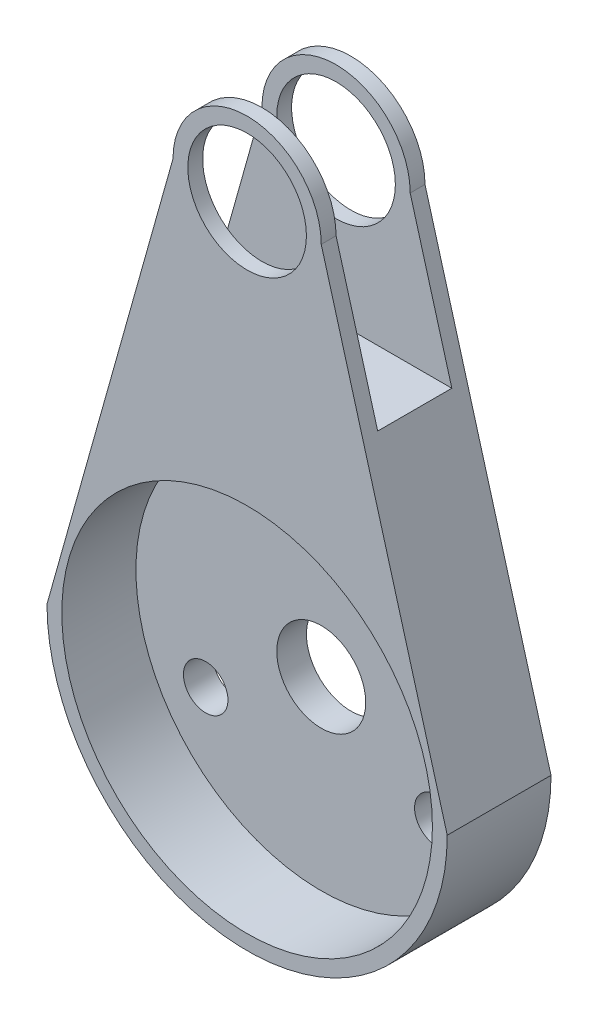
ISO-10303-21;
HEADER;
FILE_DESCRIPTION(('STEP AP214'),'2;1');
FILE_NAME('part.step','',(''),(''),'','','');
FILE_SCHEMA(('AUTOMOTIVE_DESIGN { 1 0 10303 214 1 1 1 1 }'));
ENDSEC;
DATA;
#1=APPLICATION_CONTEXT('core data for automotive mechanical design processes');
#2=APPLICATION_PROTOCOL_DEFINITION('international standard','automotive_design',2000,#1);
#3=PRODUCT_CONTEXT('',#1,'mechanical');
#4=PRODUCT('Part','Part','',(#3));
#5=PRODUCT_RELATED_PRODUCT_CATEGORY('part','',(#4));
#6=PRODUCT_DEFINITION_FORMATION('','',#4);
#7=PRODUCT_DEFINITION_CONTEXT('part definition',#1,'design');
#8=PRODUCT_DEFINITION('design','',#6,#7);
#9=PRODUCT_DEFINITION_SHAPE('','',#8);
#10=(LENGTH_UNIT() NAMED_UNIT(*) SI_UNIT(.MILLI.,.METRE.));
#11=(NAMED_UNIT(*) PLANE_ANGLE_UNIT() SI_UNIT($,.RADIAN.));
#12=(NAMED_UNIT(*) SI_UNIT($,.STERADIAN.) SOLID_ANGLE_UNIT());
#13=UNCERTAINTY_MEASURE_WITH_UNIT(LENGTH_MEASURE(1.E-05),#10,'distance_accuracy_value','');
#14=(GEOMETRIC_REPRESENTATION_CONTEXT(3) GLOBAL_UNCERTAINTY_ASSIGNED_CONTEXT((#13)) GLOBAL_UNIT_ASSIGNED_CONTEXT((#10,
#11,#12)) REPRESENTATION_CONTEXT('',''));
#15=CARTESIAN_POINT('',(0.,0.,0.));
#16=DIRECTION('',(0.,0.,1.));
#17=DIRECTION('',(1.,0.,0.));
#18=AXIS2_PLACEMENT_3D('',#15,#16,#17);
#19=CARTESIAN_POINT('',(0.,0.,7.));
#20=DIRECTION('',(0.,0.,-1.));
#21=DIRECTION('',(-1.,0.,0.));
#22=AXIS2_PLACEMENT_3D('',#19,#20,#21);
#23=CYLINDRICAL_SURFACE('',#22,5.);
#24=DIRECTION('',(0.,0.,-1.));
#25=VECTOR('',#24,1.);
#26=CARTESIAN_POINT('',(-5.,0.,7.));
#27=LINE('',#26,#25);
#28=CARTESIAN_POINT('',(-5.,0.,1.));
#29=VERTEX_POINT('',#28);
#30=CARTESIAN_POINT('',(-5.,0.,0.));
#31=VERTEX_POINT('',#30);
#32=EDGE_CURVE('E203',#29,#31,#27,.T.);
#33=ORIENTED_EDGE('',*,*,#32,.F.);
#34=CARTESIAN_POINT('',(0.,0.,0.999999999999998));
#35=DIRECTION('',(0.,0.,-1.));
#36=DIRECTION('',(-1.,0.,0.));
#37=AXIS2_PLACEMENT_3D('',#34,#35,#36);
#38=CIRCLE('',#37,5.);
#39=CARTESIAN_POINT('',(5.,0.,0.999999999999996));
#40=VERTEX_POINT('',#39);
#41=EDGE_CURVE('E144',#29,#40,#38,.T.);
#42=ORIENTED_EDGE('',*,*,#41,.T.);
#43=DIRECTION('',(0.,0.,-1.));
#44=VECTOR('',#43,1.);
#45=CARTESIAN_POINT('',(5.,0.,7.));
#46=LINE('',#45,#44);
#47=CARTESIAN_POINT('',(5.,0.,0.));
#48=VERTEX_POINT('',#47);
#49=EDGE_CURVE('E86',#40,#48,#46,.T.);
#50=ORIENTED_EDGE('',*,*,#49,.T.);
#51=CARTESIAN_POINT('',(0.,0.,0.));
#52=DIRECTION('',(0.,0.,1.));
#53=DIRECTION('',(-1.,0.,0.));
#54=AXIS2_PLACEMENT_3D('',#51,#52,#53);
#55=CIRCLE('',#54,5.);
#56=EDGE_CURVE('E180',#48,#31,#55,.T.);
#57=ORIENTED_EDGE('',*,*,#56,.T.);
#58=EDGE_LOOP('',(#33,#42,#50,#57));
#59=FACE_BOUND('',#58,.T.);
#60=ADVANCED_FACE('F41',(#59),#23,.T.);
#61=CARTESIAN_POINT('',(0.,0.,0.));
#62=DIRECTION('',(0.,0.,1.));
#63=DIRECTION('',(1.,0.,0.));
#64=AXIS2_PLACEMENT_3D('',#61,#62,#63);
#65=CYLINDRICAL_SURFACE('',#64,4.);
#66=CARTESIAN_POINT('',(0.,0.,0.999999999999999));
#67=DIRECTION('',(0.,0.,-1.));
#68=DIRECTION('',(-1.,0.,0.));
#69=AXIS2_PLACEMENT_3D('',#66,#67,#68);
#70=CIRCLE('',#69,4.);
#71=CARTESIAN_POINT('',(-4.,0.,1.));
#72=VERTEX_POINT('',#71);
#73=EDGE_CURVE('E134',#72,#72,#70,.F.);
#74=ORIENTED_EDGE('',*,*,#73,.T.);
#75=EDGE_LOOP('',(#74));
#76=FACE_BOUND('',#75,.T.);
#77=CARTESIAN_POINT('',(0.,0.,0.));
#78=DIRECTION('',(0.,0.,1.));
#79=DIRECTION('',(1.,0.,0.));
#80=AXIS2_PLACEMENT_3D('',#77,#78,#79);
#81=CIRCLE('',#80,4.);
#82=CARTESIAN_POINT('',(4.,0.,0.));
#83=VERTEX_POINT('',#82);
#84=EDGE_CURVE('E163',#83,#83,#81,.T.);
#85=ORIENTED_EDGE('',*,*,#84,.F.);
#86=EDGE_LOOP('',(#85));
#87=FACE_BOUND('',#86,.T.);
#88=ADVANCED_FACE('F243',(#76,#87),#65,.F.);
#89=CARTESIAN_POINT('',(0.,-30.2654919008431,0.));
#90=DIRECTION('',(0.,0.,1.));
#91=DIRECTION('',(1.,0.,0.));
#92=AXIS2_PLACEMENT_3D('',#89,#90,#91);
#93=CYLINDRICAL_SURFACE('',#92,3.);
#94=CARTESIAN_POINT('',(0.,-30.2654919008431,0.));
#95=DIRECTION('',(0.,0.,1.));
#96=DIRECTION('',(1.,0.,0.));
#97=AXIS2_PLACEMENT_3D('',#94,#95,#96);
#98=CIRCLE('',#97,3.);
#99=CARTESIAN_POINT('',(3.00000000000001,-30.2654919008431,0.));
#100=VERTEX_POINT('',#99);
#101=EDGE_CURVE('E172',#100,#100,#98,.T.);
#102=ORIENTED_EDGE('',*,*,#101,.F.);
#103=EDGE_LOOP('',(#102));
#104=FACE_BOUND('',#103,.T.);
#105=CARTESIAN_POINT('',(0.,-30.2654919008431,2.));
#106=DIRECTION('',(0.,0.,1.));
#107=DIRECTION('',(1.,0.,0.));
#108=AXIS2_PLACEMENT_3D('',#105,#106,#107);
#109=CIRCLE('',#108,3.);
#110=CARTESIAN_POINT('',(3.00000000000001,-30.2654919008431,2.));
#111=VERTEX_POINT('',#110);
#112=EDGE_CURVE('E159',#111,#111,#109,.F.);
#113=ORIENTED_EDGE('',*,*,#112,.F.);
#114=EDGE_LOOP('',(#113));
#115=FACE_BOUND('',#114,.T.);
#116=ADVANCED_FACE('F247',(#104,#115),#93,.F.);
#117=CARTESIAN_POINT('',(7.79422863405993,-34.7654919008432,0.));
#118=DIRECTION('',(0.,0.,1.));
#119=DIRECTION('',(1.,0.,0.));
#120=AXIS2_PLACEMENT_3D('',#117,#118,#119);
#121=CYLINDRICAL_SURFACE('',#120,1.5);
#122=CARTESIAN_POINT('',(7.79422863405993,-34.7654919008432,0.));
#123=DIRECTION('',(0.,0.,1.));
#124=DIRECTION('',(1.,0.,0.));
#125=AXIS2_PLACEMENT_3D('',#122,#123,#124);
#126=CIRCLE('',#125,1.5);
#127=CARTESIAN_POINT('',(9.29422863405993,-34.7654919008432,0.));
#128=VERTEX_POINT('',#127);
#129=EDGE_CURVE('E166',#128,#128,#126,.T.);
#130=ORIENTED_EDGE('',*,*,#129,.F.);
#131=EDGE_LOOP('',(#130));
#132=FACE_BOUND('',#131,.T.);
#133=CARTESIAN_POINT('',(7.79422863405993,-34.7654919008432,2.));
#134=DIRECTION('',(0.,0.,1.));
#135=DIRECTION('',(1.,0.,0.));
#136=AXIS2_PLACEMENT_3D('',#133,#134,#135);
#137=CIRCLE('',#136,1.5);
#138=CARTESIAN_POINT('',(9.29422863405993,-34.7654919008432,2.));
#139=VERTEX_POINT('',#138);
#140=EDGE_CURVE('E156',#139,#139,#137,.F.);
#141=ORIENTED_EDGE('',*,*,#140,.F.);
#142=EDGE_LOOP('',(#141));
#143=FACE_BOUND('',#142,.T.);
#144=ADVANCED_FACE('F263',(#132,#143),#121,.F.);
#145=CARTESIAN_POINT('',(-7.79422863405992,-34.7654919008432,0.));
#146=DIRECTION('',(0.,0.,1.));
#147=DIRECTION('',(1.,0.,0.));
#148=AXIS2_PLACEMENT_3D('',#145,#146,#147);
#149=CYLINDRICAL_SURFACE('',#148,1.5);
#150=CARTESIAN_POINT('',(-7.79422863405992,-34.7654919008432,0.));
#151=DIRECTION('',(0.,0.,1.));
#152=DIRECTION('',(1.,0.,0.));
#153=AXIS2_PLACEMENT_3D('',#150,#151,#152);
#154=CIRCLE('',#153,1.5);
#155=CARTESIAN_POINT('',(-6.29422863405992,-34.7654919008432,0.));
#156=VERTEX_POINT('',#155);
#157=EDGE_CURVE('E173',#156,#156,#154,.T.);
#158=ORIENTED_EDGE('',*,*,#157,.F.);
#159=EDGE_LOOP('',(#158));
#160=FACE_BOUND('',#159,.T.);
#161=CARTESIAN_POINT('',(-7.79422863405992,-34.7654919008432,2.));
#162=DIRECTION('',(0.,0.,1.));
#163=DIRECTION('',(1.,0.,0.));
#164=AXIS2_PLACEMENT_3D('',#161,#162,#163);
#165=CIRCLE('',#164,1.5);
#166=CARTESIAN_POINT('',(-6.29422863405992,-34.7654919008432,2.));
#167=VERTEX_POINT('',#166);
#168=EDGE_CURVE('E153',#167,#167,#165,.F.);
#169=ORIENTED_EDGE('',*,*,#168,.F.);
#170=EDGE_LOOP('',(#169));
#171=FACE_BOUND('',#170,.T.);
#172=ADVANCED_FACE('F257',(#160,#171),#149,.F.);
#173=CARTESIAN_POINT('',(0.,-21.2654919008431,0.));
#174=DIRECTION('',(0.,0.,1.));
#175=DIRECTION('',(1.,0.,0.));
#176=AXIS2_PLACEMENT_3D('',#173,#174,#175);
#177=CYLINDRICAL_SURFACE('',#176,1.5);
#178=CARTESIAN_POINT('',(0.,-21.2654919008431,0.));
#179=DIRECTION('',(0.,0.,1.));
#180=DIRECTION('',(1.,0.,0.));
#181=AXIS2_PLACEMENT_3D('',#178,#179,#180);
#182=CIRCLE('',#181,1.5);
#183=CARTESIAN_POINT('',(1.5,-21.2654919008431,0.));
#184=VERTEX_POINT('',#183);
#185=EDGE_CURVE('E169',#184,#184,#182,.T.);
#186=ORIENTED_EDGE('',*,*,#185,.F.);
#187=EDGE_LOOP('',(#186));
#188=FACE_BOUND('',#187,.T.);
#189=CARTESIAN_POINT('',(0.,-21.2654919008431,2.));
#190=DIRECTION('',(0.,0.,1.));
#191=DIRECTION('',(1.,0.,0.));
#192=AXIS2_PLACEMENT_3D('',#189,#190,#191);
#193=CIRCLE('',#192,1.5);
#194=CARTESIAN_POINT('',(1.5,-21.2654919008431,2.));
#195=VERTEX_POINT('',#194);
#196=EDGE_CURVE('E150',#195,#195,#193,.F.);
#197=ORIENTED_EDGE('',*,*,#196,.F.);
#198=EDGE_LOOP('',(#197));
#199=FACE_BOUND('',#198,.T.);
#200=ADVANCED_FACE('F252',(#188,#199),#177,.F.);
#201=CARTESIAN_POINT('',(5.,0.,7.));
#202=VERTEX_POINT('',#201);
#203=CARTESIAN_POINT('',(5.,0.,6.00000000000001));
#204=VERTEX_POINT('',#203);
#205=EDGE_CURVE('E194',#202,#204,#46,.T.);
#206=ORIENTED_EDGE('',*,*,#205,.T.);
#207=CARTESIAN_POINT('',(0.,0.,6.00000000000001));
#208=DIRECTION('',(0.,0.,1.));
#209=DIRECTION('',(1.,0.,0.));
#210=AXIS2_PLACEMENT_3D('',#207,#208,#209);
#211=CIRCLE('',#210,5.);
#212=CARTESIAN_POINT('',(-5.,0.,6.00000000000001));
#213=VERTEX_POINT('',#212);
#214=EDGE_CURVE('E135',#204,#213,#211,.T.);
#215=ORIENTED_EDGE('',*,*,#214,.T.);
#216=CARTESIAN_POINT('',(-5.,0.,7.));
#217=VERTEX_POINT('',#216);
#218=EDGE_CURVE('E49',#217,#213,#27,.T.);
#219=ORIENTED_EDGE('',*,*,#218,.F.);
#220=CARTESIAN_POINT('',(0.,0.,7.));
#221=DIRECTION('',(0.,0.,1.));
#222=DIRECTION('',(-1.,0.,0.));
#223=AXIS2_PLACEMENT_3D('',#220,#221,#222);
#224=CIRCLE('',#223,5.);
#225=EDGE_CURVE('E181',#202,#217,#224,.T.);
#226=ORIENTED_EDGE('',*,*,#225,.F.);
#227=EDGE_LOOP('',(#206,#215,#219,#226));
#228=FACE_BOUND('',#227,.T.);
#229=ADVANCED_FACE('F43',(#228),#23,.T.);
#230=CARTESIAN_POINT('',(-5.,0.,7.));
#231=DIRECTION('',(0.962751769089204,-0.270386817569955,0.));
#232=DIRECTION('',(0.270386817569955,0.962751769089204,0.));
#233=AXIS2_PLACEMENT_3D('',#230,#231,#232);
#234=PLANE('',#233);
#235=DIRECTION('',(0.,0.,1.));
#236=VECTOR('',#235,1.);
#237=CARTESIAN_POINT('',(-7.80847905193413,-10.,7.));
#238=LINE('',#237,#236);
#239=CARTESIAN_POINT('',(-7.80847905193413,-10.,1.));
#240=VERTEX_POINT('',#239);
#241=CARTESIAN_POINT('',(-7.80847905193413,-10.,6.00000000000001));
#242=VERTEX_POINT('',#241);
#243=EDGE_CURVE('E115',#240,#242,#238,.T.);
#244=ORIENTED_EDGE('',*,*,#243,.F.);
#245=DIRECTION('',(0.270386817569955,0.962751769089204,0.));
#246=VECTOR('',#245,1.);
#247=CARTESIAN_POINT('',(-5.,0.,1.));
#248=LINE('',#247,#246);
#249=EDGE_CURVE('E122',#240,#29,#248,.T.);
#250=ORIENTED_EDGE('',*,*,#249,.T.);
#251=ORIENTED_EDGE('',*,*,#32,.T.);
#252=DIRECTION('',(-0.270386817569955,-0.962751769089204,0.));
#253=VECTOR('',#252,1.);
#254=CARTESIAN_POINT('',(-5.,0.,0.));
#255=LINE('',#254,#253);
#256=CARTESIAN_POINT('',(-13.5,-30.2654919008431,0.));
#257=VERTEX_POINT('',#256);
#258=EDGE_CURVE('E189',#31,#257,#255,.T.);
#259=ORIENTED_EDGE('',*,*,#258,.T.);
#260=DIRECTION('',(0.,0.,-1.));
#261=VECTOR('',#260,1.);
#262=CARTESIAN_POINT('',(-13.5,-30.2654919008431,7.));
#263=LINE('',#262,#261);
#264=CARTESIAN_POINT('',(-13.5,-30.2654919008431,7.));
#265=VERTEX_POINT('',#264);
#266=EDGE_CURVE('E200',#265,#257,#263,.T.);
#267=ORIENTED_EDGE('',*,*,#266,.F.);
#268=DIRECTION('',(-0.270386817569955,-0.962751769089204,0.));
#269=VECTOR('',#268,1.);
#270=CARTESIAN_POINT('',(-5.,0.,7.));
#271=LINE('',#270,#269);
#272=EDGE_CURVE('E94',#217,#265,#271,.T.);
#273=ORIENTED_EDGE('',*,*,#272,.F.);
#274=ORIENTED_EDGE('',*,*,#218,.T.);
#275=DIRECTION('',(-0.270386817569955,-0.962751769089204,0.));
#276=VECTOR('',#275,1.);
#277=CARTESIAN_POINT('',(-5.,0.,6.00000000000001));
#278=LINE('',#277,#276);
#279=EDGE_CURVE('E126',#213,#242,#278,.T.);
#280=ORIENTED_EDGE('',*,*,#279,.T.);
#281=EDGE_LOOP('',(#244,#250,#251,#259,#267,#273,#274,#280));
#282=FACE_BOUND('',#281,.T.);
#283=ADVANCED_FACE('F132',(#282),#234,.F.);
#284=CARTESIAN_POINT('',(0.,-30.2654919008431,7.));
#285=DIRECTION('',(0.,0.,-1.));
#286=DIRECTION('',(-1.,0.,0.));
#287=AXIS2_PLACEMENT_3D('',#284,#285,#286);
#288=CYLINDRICAL_SURFACE('',#287,13.5);
#289=CARTESIAN_POINT('',(0.,-30.2654919008431,0.));
#290=DIRECTION('',(0.,0.,1.));
#291=DIRECTION('',(1.,0.,0.));
#292=AXIS2_PLACEMENT_3D('',#289,#290,#291);
#293=CIRCLE('',#292,13.5);
#294=CARTESIAN_POINT('',(13.5,-30.2654919008431,0.));
#295=VERTEX_POINT('',#294);
#296=EDGE_CURVE('E191',#257,#295,#293,.T.);
#297=ORIENTED_EDGE('',*,*,#296,.T.);
#298=DIRECTION('',(0.,0.,-1.));
#299=VECTOR('',#298,1.);
#300=CARTESIAN_POINT('',(13.5,-30.2654919008431,7.));
#301=LINE('',#300,#299);
#302=CARTESIAN_POINT('',(13.5,-30.2654919008431,7.));
#303=VERTEX_POINT('',#302);
#304=EDGE_CURVE('E197',#303,#295,#301,.T.);
#305=ORIENTED_EDGE('',*,*,#304,.F.);
#306=CARTESIAN_POINT('',(0.,-30.2654919008431,7.));
#307=DIRECTION('',(0.,0.,1.));
#308=DIRECTION('',(1.,0.,0.));
#309=AXIS2_PLACEMENT_3D('',#306,#307,#308);
#310=CIRCLE('',#309,13.5);
#311=EDGE_CURVE('E185',#265,#303,#310,.T.);
#312=ORIENTED_EDGE('',*,*,#311,.F.);
#313=ORIENTED_EDGE('',*,*,#266,.T.);
#314=EDGE_LOOP('',(#297,#305,#312,#313));
#315=FACE_BOUND('',#314,.T.);
#316=ADVANCED_FACE('F222',(#315),#288,.T.);
#317=CARTESIAN_POINT('',(5.,0.,7.));
#318=DIRECTION('',(-0.962751769089204,-0.270386817569955,0.));
#319=DIRECTION('',(0.270386817569955,-0.962751769089204,0.));
#320=AXIS2_PLACEMENT_3D('',#317,#318,#319);
#321=PLANE('',#320);
#322=ORIENTED_EDGE('',*,*,#49,.F.);
#323=DIRECTION('',(0.270386817569955,-0.962751769089204,0.));
#324=VECTOR('',#323,1.);
#325=CARTESIAN_POINT('',(5.,0.,0.999999999999996));
#326=LINE('',#325,#324);
#327=CARTESIAN_POINT('',(7.80847905193413,-10.,0.999999999999994));
#328=VERTEX_POINT('',#327);
#329=EDGE_CURVE('E138',#40,#328,#326,.T.);
#330=ORIENTED_EDGE('',*,*,#329,.T.);
#331=DIRECTION('',(0.,0.,-1.));
#332=VECTOR('',#331,1.);
#333=CARTESIAN_POINT('',(7.80847905193413,-10.,7.));
#334=LINE('',#333,#332);
#335=CARTESIAN_POINT('',(7.80847905193413,-10.,6.00000000000001));
#336=VERTEX_POINT('',#335);
#337=EDGE_CURVE('E11',#336,#328,#334,.T.);
#338=ORIENTED_EDGE('',*,*,#337,.F.);
#339=DIRECTION('',(-0.270386817569955,0.962751769089204,0.));
#340=VECTOR('',#339,1.);
#341=CARTESIAN_POINT('',(5.,0.,6.00000000000001));
#342=LINE('',#341,#340);
#343=EDGE_CURVE('E129',#336,#204,#342,.T.);
#344=ORIENTED_EDGE('',*,*,#343,.T.);
#345=ORIENTED_EDGE('',*,*,#205,.F.);
#346=DIRECTION('',(-0.270386817569955,0.962751769089204,0.));
#347=VECTOR('',#346,1.);
#348=CARTESIAN_POINT('',(5.,0.,7.));
#349=LINE('',#348,#347);
#350=EDGE_CURVE('E64',#303,#202,#349,.T.);
#351=ORIENTED_EDGE('',*,*,#350,.F.);
#352=ORIENTED_EDGE('',*,*,#304,.T.);
#353=DIRECTION('',(-0.270386817569955,0.962751769089204,0.));
#354=VECTOR('',#353,1.);
#355=CARTESIAN_POINT('',(5.,0.,0.));
#356=LINE('',#355,#354);
#357=EDGE_CURVE('E183',#295,#48,#356,.T.);
#358=ORIENTED_EDGE('',*,*,#357,.T.);
#359=EDGE_LOOP('',(#322,#330,#338,#344,#345,#351,#352,#358));
#360=FACE_BOUND('',#359,.T.);
#361=ADVANCED_FACE('F213',(#360),#321,.F.);
#362=CARTESIAN_POINT('',(0.,0.,7.));
#363=DIRECTION('',(0.,0.,-1.));
#364=DIRECTION('',(-1.,0.,0.));
#365=AXIS2_PLACEMENT_3D('',#362,#363,#364);
#366=PLANE('',#365);
#367=CARTESIAN_POINT('',(0.,-30.2654919008431,7.));
#368=DIRECTION('',(0.,0.,1.));
#369=DIRECTION('',(1.,0.,0.));
#370=AXIS2_PLACEMENT_3D('',#367,#368,#369);
#371=CIRCLE('',#370,12.5);
#372=CARTESIAN_POINT('',(12.5,-30.2654919008431,7.));
#373=VERTEX_POINT('',#372);
#374=EDGE_CURVE('E121',#373,#373,#371,.T.);
#375=ORIENTED_EDGE('',*,*,#374,.F.);
#376=EDGE_LOOP('',(#375));
#377=FACE_BOUND('',#376,.T.);
#378=CARTESIAN_POINT('',(0.,0.,7.));
#379=DIRECTION('',(0.,0.,1.));
#380=DIRECTION('',(1.,0.,0.));
#381=AXIS2_PLACEMENT_3D('',#378,#379,#380);
#382=CIRCLE('',#381,4.);
#383=CARTESIAN_POINT('',(4.,0.,7.));
#384=VERTEX_POINT('',#383);
#385=EDGE_CURVE('E162',#384,#384,#382,.T.);
#386=ORIENTED_EDGE('',*,*,#385,.F.);
#387=EDGE_LOOP('',(#386));
#388=FACE_BOUND('',#387,.T.);
#389=ORIENTED_EDGE('',*,*,#225,.T.);
#390=ORIENTED_EDGE('',*,*,#272,.T.);
#391=ORIENTED_EDGE('',*,*,#311,.T.);
#392=ORIENTED_EDGE('',*,*,#350,.T.);
#393=EDGE_LOOP('',(#389,#390,#391,#392));
#394=FACE_BOUND('',#393,.T.);
#395=ADVANCED_FACE('F216',(#377,#388,#394),#366,.F.);
#396=CARTESIAN_POINT('',(0.,0.,0.));
#397=DIRECTION('',(0.,0.,-1.));
#398=DIRECTION('',(-1.,0.,0.));
#399=AXIS2_PLACEMENT_3D('',#396,#397,#398);
#400=PLANE('',#399);
#401=ORIENTED_EDGE('',*,*,#84,.T.);
#402=EDGE_LOOP('',(#401));
#403=FACE_BOUND('',#402,.T.);
#404=ORIENTED_EDGE('',*,*,#185,.T.);
#405=EDGE_LOOP('',(#404));
#406=FACE_BOUND('',#405,.T.);
#407=ORIENTED_EDGE('',*,*,#157,.T.);
#408=EDGE_LOOP('',(#407));
#409=FACE_BOUND('',#408,.T.);
#410=ORIENTED_EDGE('',*,*,#129,.T.);
#411=EDGE_LOOP('',(#410));
#412=FACE_BOUND('',#411,.T.);
#413=ORIENTED_EDGE('',*,*,#101,.T.);
#414=EDGE_LOOP('',(#413));
#415=FACE_BOUND('',#414,.T.);
#416=ORIENTED_EDGE('',*,*,#56,.F.);
#417=ORIENTED_EDGE('',*,*,#357,.F.);
#418=ORIENTED_EDGE('',*,*,#296,.F.);
#419=ORIENTED_EDGE('',*,*,#258,.F.);
#420=EDGE_LOOP('',(#416,#417,#418,#419));
#421=FACE_BOUND('',#420,.T.);
#422=ADVANCED_FACE('F226',(#403,#406,#409,#412,#415,#421),#400,.T.);
#423=CARTESIAN_POINT('',(0.,0.,6.00000000000001));
#424=DIRECTION('',(0.,0.,1.));
#425=DIRECTION('',(1.,0.,0.));
#426=AXIS2_PLACEMENT_3D('',#423,#424,#425);
#427=CIRCLE('',#426,4.);
#428=CARTESIAN_POINT('',(4.,0.,6.00000000000001));
#429=VERTEX_POINT('',#428);
#430=EDGE_CURVE('E207',#429,#429,#427,.F.);
#431=ORIENTED_EDGE('',*,*,#430,.T.);
#432=EDGE_LOOP('',(#431));
#433=FACE_BOUND('',#432,.T.);
#434=ORIENTED_EDGE('',*,*,#385,.T.);
#435=EDGE_LOOP('',(#434));
#436=FACE_BOUND('',#435,.T.);
#437=ADVANCED_FACE('F250',(#433,#436),#65,.F.);
#438=CARTESIAN_POINT('',(0.,-30.2654919008431,2.));
#439=DIRECTION('',(0.,0.,1.));
#440=DIRECTION('',(1.,0.,0.));
#441=AXIS2_PLACEMENT_3D('',#438,#439,#440);
#442=PLANE('',#441);
#443=CARTESIAN_POINT('',(0.,-30.2654919008431,2.));
#444=DIRECTION('',(0.,0.,1.));
#445=DIRECTION('',(1.,0.,0.));
#446=AXIS2_PLACEMENT_3D('',#443,#444,#445);
#447=CIRCLE('',#446,12.5);
#448=CARTESIAN_POINT('',(12.5,-30.2654919008431,2.));
#449=VERTEX_POINT('',#448);
#450=EDGE_CURVE('E147',#449,#449,#447,.T.);
#451=ORIENTED_EDGE('',*,*,#450,.T.);
#452=EDGE_LOOP('',(#451));
#453=FACE_BOUND('',#452,.T.);
#454=ORIENTED_EDGE('',*,*,#196,.T.);
#455=EDGE_LOOP('',(#454));
#456=FACE_BOUND('',#455,.T.);
#457=ORIENTED_EDGE('',*,*,#168,.T.);
#458=EDGE_LOOP('',(#457));
#459=FACE_BOUND('',#458,.T.);
#460=ORIENTED_EDGE('',*,*,#140,.T.);
#461=EDGE_LOOP('',(#460));
#462=FACE_BOUND('',#461,.T.);
#463=ORIENTED_EDGE('',*,*,#112,.T.);
#464=EDGE_LOOP('',(#463));
#465=FACE_BOUND('',#464,.T.);
#466=ADVANCED_FACE('F311',(#453,#456,#459,#462,#465),#442,.T.);
#467=CARTESIAN_POINT('',(0.,-30.2654919008431,2.));
#468=DIRECTION('',(0.,0.,1.));
#469=DIRECTION('',(1.,0.,0.));
#470=AXIS2_PLACEMENT_3D('',#467,#468,#469);
#471=CYLINDRICAL_SURFACE('',#470,12.5);
#472=ORIENTED_EDGE('',*,*,#450,.F.);
#473=EDGE_LOOP('',(#472));
#474=FACE_BOUND('',#473,.T.);
#475=ORIENTED_EDGE('',*,*,#374,.T.);
#476=EDGE_LOOP('',(#475));
#477=FACE_BOUND('',#476,.T.);
#478=ADVANCED_FACE('F239',(#474,#477),#471,.F.);
#479=CARTESIAN_POINT('',(0.,-10.,0.));
#480=DIRECTION('',(0.,1.,0.));
#481=DIRECTION('',(0.,0.,1.));
#482=AXIS2_PLACEMENT_3D('',#479,#480,#481);
#483=PLANE('',#482);
#484=ORIENTED_EDGE('',*,*,#243,.T.);
#485=DIRECTION('',(1.,0.,0.));
#486=VECTOR('',#485,1.);
#487=CARTESIAN_POINT('',(-13.5,-10.,6.00000000000001));
#488=LINE('',#487,#486);
#489=EDGE_CURVE('E55',#242,#336,#488,.T.);
#490=ORIENTED_EDGE('',*,*,#489,.T.);
#491=ORIENTED_EDGE('',*,*,#337,.T.);
#492=DIRECTION('',(-1.,0.,0.));
#493=VECTOR('',#492,1.);
#494=CARTESIAN_POINT('',(-13.5,-10.,1.00000000000001));
#495=LINE('',#494,#493);
#496=EDGE_CURVE('E118',#328,#240,#495,.T.);
#497=ORIENTED_EDGE('',*,*,#496,.T.);
#498=EDGE_LOOP('',(#484,#490,#491,#497));
#499=FACE_BOUND('',#498,.T.);
#500=ADVANCED_FACE('F116',(#499),#483,.T.);
#501=CARTESIAN_POINT('',(-13.5,-10.,1.00000000000001));
#502=DIRECTION('',(0.,0.,-1.));
#503=DIRECTION('',(-1.,0.,0.));
#504=AXIS2_PLACEMENT_3D('',#501,#502,#503);
#505=PLANE('',#504);
#506=ORIENTED_EDGE('',*,*,#73,.F.);
#507=EDGE_LOOP('',(#506));
#508=FACE_BOUND('',#507,.T.);
#509=ORIENTED_EDGE('',*,*,#496,.F.);
#510=ORIENTED_EDGE('',*,*,#329,.F.);
#511=ORIENTED_EDGE('',*,*,#41,.F.);
#512=ORIENTED_EDGE('',*,*,#249,.F.);
#513=EDGE_LOOP('',(#509,#510,#511,#512));
#514=FACE_BOUND('',#513,.T.);
#515=ADVANCED_FACE('F229',(#508,#514),#505,.F.);
#516=CARTESIAN_POINT('',(-13.5,-10.,6.00000000000001));
#517=DIRECTION('',(0.,0.,1.));
#518=DIRECTION('',(1.,0.,0.));
#519=AXIS2_PLACEMENT_3D('',#516,#517,#518);
#520=PLANE('',#519);
#521=ORIENTED_EDGE('',*,*,#430,.F.);
#522=EDGE_LOOP('',(#521));
#523=FACE_BOUND('',#522,.T.);
#524=ORIENTED_EDGE('',*,*,#214,.F.);
#525=ORIENTED_EDGE('',*,*,#343,.F.);
#526=ORIENTED_EDGE('',*,*,#489,.F.);
#527=ORIENTED_EDGE('',*,*,#279,.F.);
#528=EDGE_LOOP('',(#524,#525,#526,#527));
#529=FACE_BOUND('',#528,.T.);
#530=ADVANCED_FACE('F125',(#523,#529),#520,.F.);
#531=CLOSED_SHELL('',(#60,#88,#116,#144,#172,#200,#229,#283,#316,#361,#395,#422,#437,#466,#478,
#500,#515,#530));
#532=MANIFOLD_SOLID_BREP('B2',#531);
#533=ADVANCED_BREP_SHAPE_REPRESENTATION('',(#18,#532),#14);
#534=SHAPE_DEFINITION_REPRESENTATION(#9,#533);
ENDSEC;
END-ISO-10303-21;
